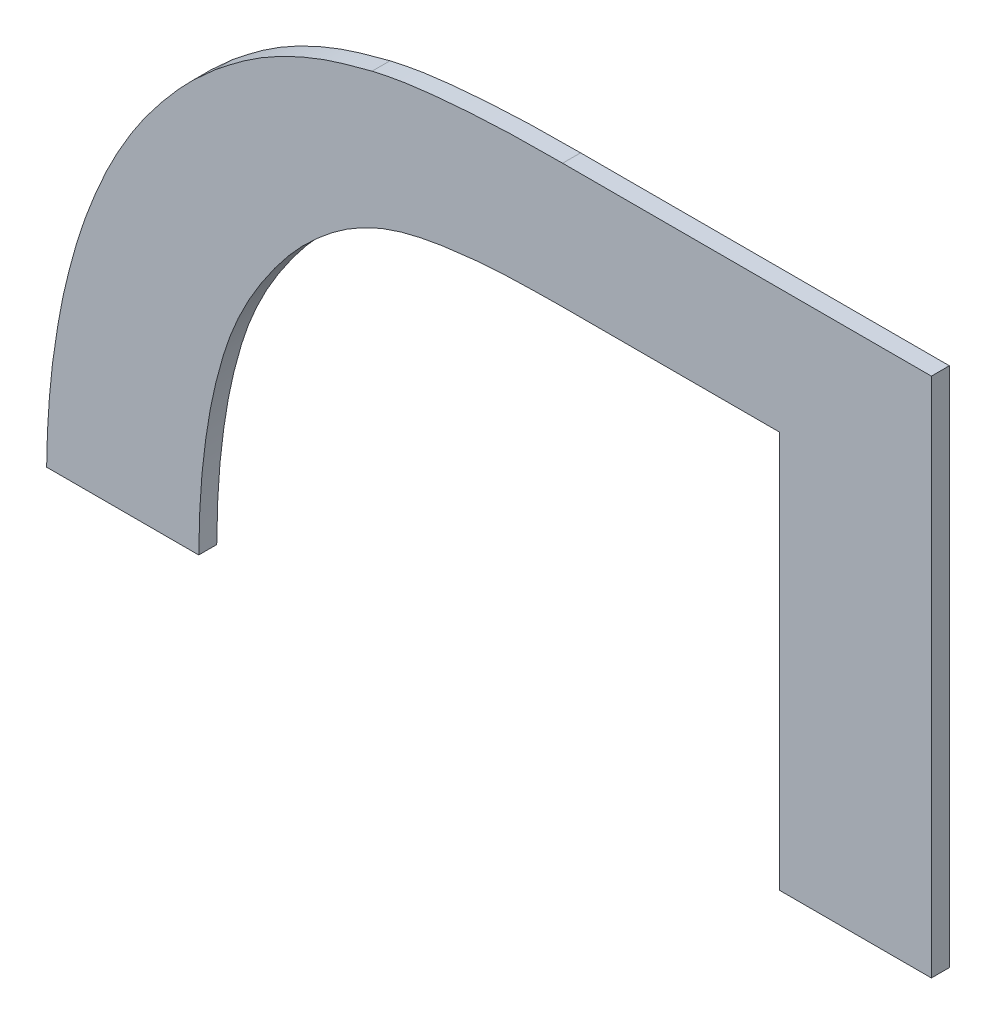
ISO-10303-21;
HEADER;
FILE_DESCRIPTION(('STEP AP214'),'2;1');
FILE_NAME('part.step','',(''),(''),'','','');
FILE_SCHEMA(('AUTOMOTIVE_DESIGN { 1 0 10303 214 1 1 1 1 }'));
ENDSEC;
DATA;
#1=APPLICATION_CONTEXT('core data for automotive mechanical design processes');
#2=APPLICATION_PROTOCOL_DEFINITION('international standard','automotive_design',2000,#1);
#3=PRODUCT_CONTEXT('',#1,'mechanical');
#4=PRODUCT('Part','Part','',(#3));
#5=PRODUCT_RELATED_PRODUCT_CATEGORY('part','',(#4));
#6=PRODUCT_DEFINITION_FORMATION('','',#4);
#7=PRODUCT_DEFINITION_CONTEXT('part definition',#1,'design');
#8=PRODUCT_DEFINITION('design','',#6,#7);
#9=PRODUCT_DEFINITION_SHAPE('','',#8);
#10=(LENGTH_UNIT() NAMED_UNIT(*) SI_UNIT(.MILLI.,.METRE.));
#11=(NAMED_UNIT(*) PLANE_ANGLE_UNIT() SI_UNIT($,.RADIAN.));
#12=(NAMED_UNIT(*) SI_UNIT($,.STERADIAN.) SOLID_ANGLE_UNIT());
#13=UNCERTAINTY_MEASURE_WITH_UNIT(LENGTH_MEASURE(1.E-05),#10,'distance_accuracy_value','');
#14=(GEOMETRIC_REPRESENTATION_CONTEXT(3) GLOBAL_UNCERTAINTY_ASSIGNED_CONTEXT((#13)) GLOBAL_UNIT_ASSIGNED_CONTEXT((#10,
#11,#12)) REPRESENTATION_CONTEXT('',''));
#15=CARTESIAN_POINT('',(0.,0.,0.));
#16=DIRECTION('',(0.,0.,1.));
#17=DIRECTION('',(1.,0.,0.));
#18=AXIS2_PLACEMENT_3D('',#15,#16,#17);
#19=CARTESIAN_POINT('',(11.5384615384616,-15.,0.5));
#20=DIRECTION('',(-1.,0.,0.));
#21=DIRECTION('',(0.,0.,1.));
#22=AXIS2_PLACEMENT_3D('',#19,#20,#21);
#23=PLANE('',#22);
#24=DIRECTION('',(0.,1.,0.));
#25=VECTOR('',#24,1.);
#26=CARTESIAN_POINT('',(11.5384615384616,-15.,0.5));
#27=LINE('',#26,#25);
#28=CARTESIAN_POINT('',(11.5384615384616,0.5,0.5));
#29=VERTEX_POINT('',#28);
#30=CARTESIAN_POINT('',(11.5384615384616,15.,0.5));
#31=VERTEX_POINT('',#30);
#32=EDGE_CURVE('E192',#29,#31,#27,.T.);
#33=ORIENTED_EDGE('',*,*,#32,.F.);
#34=DIRECTION('',(0.,0.,-1.));
#35=VECTOR('',#34,1.);
#36=CARTESIAN_POINT('',(11.5384615384616,0.5,0.5));
#37=LINE('',#36,#35);
#38=CARTESIAN_POINT('',(11.5384615384616,0.5,0.));
#39=VERTEX_POINT('',#38);
#40=EDGE_CURVE('E54',#29,#39,#37,.T.);
#41=ORIENTED_EDGE('',*,*,#40,.T.);
#42=DIRECTION('',(0.,1.,0.));
#43=VECTOR('',#42,1.);
#44=CARTESIAN_POINT('',(11.5384615384616,-15.,0.));
#45=LINE('',#44,#43);
#46=CARTESIAN_POINT('',(11.5384615384616,15.,0.));
#47=VERTEX_POINT('',#46);
#48=EDGE_CURVE('E204',#39,#47,#45,.T.);
#49=ORIENTED_EDGE('',*,*,#48,.T.);
#50=DIRECTION('',(0.,0.,-1.));
#51=VECTOR('',#50,1.);
#52=CARTESIAN_POINT('',(11.5384615384616,15.,0.5));
#53=LINE('',#52,#51);
#54=EDGE_CURVE('E191',#31,#47,#53,.T.);
#55=ORIENTED_EDGE('',*,*,#54,.F.);
#56=EDGE_LOOP('',(#33,#41,#49,#55));
#57=FACE_BOUND('',#56,.T.);
#58=ADVANCED_FACE('F39',(#57),#23,.F.);
#59=CARTESIAN_POINT('',(-1.382682115,14.9217036371468,0.5));
#60=DIRECTION('',(0.,0.,-1.));
#61=DIRECTION('',(-1.,0.,0.));
#62=AXIS2_PLACEMENT_3D('',#59,#60,#61);
#63=PLANE('',#62);
#64=CARTESIAN_POINT('',(-8.38341346153845,12.421875,0.5));
#65=CARTESIAN_POINT('',(-8.5763742109185,12.2524241476414,0.5));
#66=CARTESIAN_POINT('',(-8.96316917127404,11.9127554018949,0.5));
#67=CARTESIAN_POINT('',(-9.49442974637986,11.3531263259938,0.5));
#68=CARTESIAN_POINT('',(-9.98727140197635,10.7594508263141,0.5));
#69=CARTESIAN_POINT('',(-10.4564145661786,10.1419495197791,0.5));
#70=CARTESIAN_POINT('',(-10.8718532675337,9.47810992962567,0.5));
#71=CARTESIAN_POINT('',(-11.2612687557637,8.78703913595091,0.5));
#72=CARTESIAN_POINT('',(-11.6009333603342,8.05485950898088,0.5));
#73=CARTESIAN_POINT('',(-11.9135895116652,7.29353697132062,0.5));
#74=CARTESIAN_POINT('',(-12.1921448110855,6.50010412293509,0.5));
#75=CARTESIAN_POINT('',(-12.4210240181232,5.67507335119183,0.5));
#76=CARTESIAN_POINT('',(-12.6312911639853,4.82705995563567,0.5));
#77=CARTESIAN_POINT('',(-12.7876810881269,3.94679418723253,0.5));
#78=CARTESIAN_POINT('',(-12.9242014022081,3.04174255553388,0.5));
#79=CARTESIAN_POINT('',(-13.0108681859765,2.10672489963748,0.5));
#80=CARTESIAN_POINT('',(-13.0671005095875,1.14453241181177,0.5));
#81=CARTESIAN_POINT('',(-13.0736170055521,0.492872158907407,0.5));
#82=CARTESIAN_POINT('',(-13.0769230769231,0.162259615384614,0.5));
#83=B_SPLINE_CURVE_WITH_KNOTS('',3,(#64,#65,#66,#67,#68,#69,#70,#71,#72,#73,#74,#75,#76,#77,#78,
#79,#80,#81,#82),.UNSPECIFIED.,.F.,.F.,(4,1,1,1,1,1,1,1,1,1,1,1,1,1,1,1,4),(0.,
0.0568123354227024,0.113881839172627,0.170533068412123,0.227547439190597,0.285352691696646,
0.343701141573051,0.403000229313918,0.463842105103536,0.525815476342276,0.588967004682394,
0.653270524442472,0.719096589325222,0.786748639620031,0.855788310662137,0.92683581175127,1.),.UNSPECIFIED.);
#84=CARTESIAN_POINT('',(-8.38341346153845,12.421875,0.5));
#85=VERTEX_POINT('',#84);
#86=CARTESIAN_POINT('',(-13.0732253562633,0.5,0.5));
#87=VERTEX_POINT('',#86);
#88=EDGE_CURVE('E207',#85,#87,#83,.T.);
#89=ORIENTED_EDGE('',*,*,#88,.T.);
#90=DIRECTION('',(1.,0.,0.));
#91=VECTOR('',#90,1.);
#92=CARTESIAN_POINT('',(-1.382682115,0.5,0.5));
#93=LINE('',#92,#91);
#94=CARTESIAN_POINT('',(-8.84239701724573,0.5,0.5));
#95=VERTEX_POINT('',#94);
#96=EDGE_CURVE('E154',#87,#95,#93,.T.);
#97=ORIENTED_EDGE('',*,*,#96,.T.);
#98=CARTESIAN_POINT('',(-8.84615384615383,0.228365384615384,0.5));
#99=CARTESIAN_POINT('',(-8.84102265070386,0.611040812282681,0.5));
#100=CARTESIAN_POINT('',(-8.83104781455846,1.35494634561712,0.5));
#101=CARTESIAN_POINT('',(-8.7688632524729,2.43869195236612,0.5));
#102=CARTESIAN_POINT('',(-8.64610178114751,3.45296942584759,0.5));
#103=CARTESIAN_POINT('',(-8.48910134496591,4.39953306617696,0.5));
#104=CARTESIAN_POINT('',(-8.27474187359549,5.27537405447266,0.5));
#105=CARTESIAN_POINT('',(-8.02961811139682,6.0888839197475,0.5));
#106=CARTESIAN_POINT('',(-7.72124401259251,6.82942808224367,0.5));
#107=CARTESIAN_POINT('',(-7.36935137220557,7.50272356268187,0.5));
#108=CARTESIAN_POINT('',(-6.98332105801368,8.11324175983455,0.5));
#109=CARTESIAN_POINT('',(-6.58106360601976,8.6740961885661,0.5));
#110=CARTESIAN_POINT('',(-6.16052047137857,9.18344801718626,0.5));
#111=CARTESIAN_POINT('',(-5.71278067027083,9.63405007431265,0.5));
#112=CARTESIAN_POINT('',(-5.25130378739005,10.0392276651512,0.5));
#113=CARTESIAN_POINT('',(-4.76748665165962,10.3906854413108,0.5));
#114=CARTESIAN_POINT('',(-4.26268315422816,10.6883154133846,0.5));
#115=CARTESIAN_POINT('',(-3.90796096504983,10.8428174224566,0.5));
#116=CARTESIAN_POINT('',(-3.73197115384614,10.9194711538462,0.5));
#117=B_SPLINE_CURVE_WITH_KNOTS('',3,(#98,#99,#100,#101,#102,#103,#104,#105,#106,#107,#108,#109,
#110,#111,#112,#113,#114,#115,#116),.UNSPECIFIED.,.F.,.F.,(4,1,1,1,1,1,1,1,1,1,1,1,1,1,1,1,4),
(0.,0.0912579285711475,0.177401717268708,0.258693902805723,0.334791460647046,0.406045096597495,
0.473581442146877,0.537187194017057,0.597012411269007,0.654533357810073,0.709286197928439,
0.76151799593466,0.811847549047066,0.860604237354614,0.907805749105046,0.954259278657893,1.),.UNSPECIFIED.);
#118=CARTESIAN_POINT('',(-3.73197115384614,10.9194711538462,0.5));
#119=VERTEX_POINT('',#118);
#120=EDGE_CURVE('E146',#95,#119,#117,.T.);
#121=ORIENTED_EDGE('',*,*,#120,.T.);
#122=CARTESIAN_POINT('',(-3.73197115384614,10.9194711538462,0.5));
#123=CARTESIAN_POINT('',(-3.59445970567046,10.969794396746,0.5));
#124=CARTESIAN_POINT('',(-3.30308196474431,11.0764260483414,0.5));
#125=CARTESIAN_POINT('',(-2.82752523642942,11.1971170413422,0.5));
#126=CARTESIAN_POINT('',(-2.29679911688819,11.3081861854801,0.5));
#127=CARTESIAN_POINT('',(-1.70567242577352,11.3861422428105,0.5));
#128=CARTESIAN_POINT('',(-1.05713477037848,11.4619070265259,0.5));
#129=CARTESIAN_POINT('',(-0.347154860933927,11.5079477117086,0.5));
#130=CARTESIAN_POINT('',(0.420543764518022,11.5288121402493,0.5));
#131=CARTESIAN_POINT('',(0.95151171086871,11.5351734614394,0.5));
#132=CARTESIAN_POINT('',(1.22596153846156,11.5384615384615,0.5));
#133=B_SPLINE_CURVE_WITH_KNOTS('',3,(#122,#123,#124,#125,#126,#127,#128,#129,#130,#131,#132),
.UNSPECIFIED.,.F.,.F.,(4,1,1,1,1,1,1,1,4),(0.,0.0874250109285977,0.185247864979759,
0.292738353989421,0.411206101677025,0.541245594232324,0.682780938524953,0.836033950204801,1.),.UNSPECIFIED.);
#134=CARTESIAN_POINT('',(1.22596153846156,11.5384615384615,0.5));
#135=VERTEX_POINT('',#134);
#136=EDGE_CURVE('E130',#119,#135,#133,.T.);
#137=ORIENTED_EDGE('',*,*,#136,.T.);
#138=DIRECTION('',(1.,0.,0.));
#139=VECTOR('',#138,1.);
#140=CARTESIAN_POINT('',(1.22596153846156,11.5384615384615,0.5));
#141=LINE('',#140,#139);
#142=CARTESIAN_POINT('',(7.30769230769232,11.5384615384615,0.5));
#143=VERTEX_POINT('',#142);
#144=EDGE_CURVE('E136',#135,#143,#141,.T.);
#145=ORIENTED_EDGE('',*,*,#144,.T.);
#146=DIRECTION('',(0.,-1.,0.));
#147=VECTOR('',#146,1.);
#148=CARTESIAN_POINT('',(7.30769230769232,11.5384615384615,0.5));
#149=LINE('',#148,#147);
#150=CARTESIAN_POINT('',(7.30769230769232,0.5,0.5));
#151=VERTEX_POINT('',#150);
#152=EDGE_CURVE('E145',#143,#151,#149,.T.);
#153=ORIENTED_EDGE('',*,*,#152,.T.);
#154=EDGE_CURVE('E80',#151,#29,#93,.T.);
#155=ORIENTED_EDGE('',*,*,#154,.T.);
#156=ORIENTED_EDGE('',*,*,#32,.T.);
#157=DIRECTION('',(-1.,0.,0.));
#158=VECTOR('',#157,1.);
#159=CARTESIAN_POINT('',(11.5384615384616,15.,0.5));
#160=LINE('',#159,#158);
#161=CARTESIAN_POINT('',(1.28004807692309,15.,0.5));
#162=VERTEX_POINT('',#161);
#163=EDGE_CURVE('E197',#31,#162,#160,.T.);
#164=ORIENTED_EDGE('',*,*,#163,.T.);
#165=CARTESIAN_POINT('',(1.28004807692309,15.,0.5));
#166=CARTESIAN_POINT('',(0.999596733269862,14.9987330296525,0.5));
#167=CARTESIAN_POINT('',(0.454658301155939,14.996271209268,0.5));
#168=CARTESIAN_POINT('',(-0.33692015294195,14.9805809678215,0.5));
#169=CARTESIAN_POINT('',(-1.07812705706637,14.9427362679626,0.5));
#170=CARTESIAN_POINT('',(-1.76554701819305,14.8966364176264,0.5));
#171=CARTESIAN_POINT('',(-2.40264701489753,14.8352584266667,0.5));
#172=CARTESIAN_POINT('',(-2.98861310888563,14.7666225511488,0.5));
#173=CARTESIAN_POINT('',(-3.52390251528144,14.6770960246085,0.5));
#174=CARTESIAN_POINT('',(-3.86044482557913,14.6026827850799,0.5));
#175=CARTESIAN_POINT('',(-4.02043269230767,14.5673076923077,0.5));
#176=B_SPLINE_CURVE_WITH_KNOTS('',3,(#165,#166,#167,#168,#169,#170,#171,#172,#173,#174,#175),
.UNSPECIFIED.,.F.,.F.,(4,1,1,1,1,1,1,1,4),(0.,0.157890974512345,0.306794251633478,
0.445674152625697,0.575680435633188,0.694631463926725,0.805977805205995,0.907764355050554,1.),.UNSPECIFIED.);
#177=CARTESIAN_POINT('',(-4.02043269230767,14.5673076923077,0.5));
#178=VERTEX_POINT('',#177);
#179=EDGE_CURVE('E200',#162,#178,#176,.T.);
#180=ORIENTED_EDGE('',*,*,#179,.T.);
#181=CARTESIAN_POINT('',(-4.02043269230767,14.5673076923077,0.5));
#182=CARTESIAN_POINT('',(-4.43418888236122,14.458753919871,0.5));
#183=CARTESIAN_POINT('',(-5.24705334367218,14.2454894276984,0.5));
#184=CARTESIAN_POINT('',(-6.39449703356027,13.7657785192818,0.5));
#185=CARTESIAN_POINT('',(-7.44790027478785,13.16406871538,0.5));
#186=CARTESIAN_POINT('',(-8.07263471229969,12.6684327586991,0.5));
#187=CARTESIAN_POINT('',(-8.38341346153845,12.421875,0.5));
#188=B_SPLINE_CURVE_WITH_KNOTS('',3,(#181,#182,#183,#184,#185,#186,#187),.UNSPECIFIED.,.F.,.F.,
(4,1,1,1,4),(0.,0.26119485261401,0.513142807941568,0.757809302447896,1.),.UNSPECIFIED.);
#189=EDGE_CURVE('E208',#178,#85,#188,.T.);
#190=ORIENTED_EDGE('',*,*,#189,.T.);
#191=EDGE_LOOP('',(#89,#97,#121,#137,#145,#153,#155,#156,#164,#180,#190));
#192=FACE_BOUND('',#191,.T.);
#193=ADVANCED_FACE('F147',(#192),#63,.F.);
#194=CARTESIAN_POINT('',(7.30769230769232,11.5384615384615,0.5));
#195=DIRECTION('',(1.,0.,0.));
#196=DIRECTION('',(0.,0.,-1.));
#197=AXIS2_PLACEMENT_3D('',#194,#195,#196);
#198=PLANE('',#197);
#199=DIRECTION('',(0.,-1.,0.));
#200=VECTOR('',#199,1.);
#201=CARTESIAN_POINT('',(7.30769230769232,11.5384615384615,0.));
#202=LINE('',#201,#200);
#203=CARTESIAN_POINT('',(7.30769230769232,11.5384615384615,0.));
#204=VERTEX_POINT('',#203);
#205=CARTESIAN_POINT('',(7.30769230769232,0.5,0.));
#206=VERTEX_POINT('',#205);
#207=EDGE_CURVE('E209',#204,#206,#202,.T.);
#208=ORIENTED_EDGE('',*,*,#207,.T.);
#209=DIRECTION('',(0.,0.,1.));
#210=VECTOR('',#209,1.);
#211=CARTESIAN_POINT('',(7.30769230769232,0.5,0.5));
#212=LINE('',#211,#210);
#213=EDGE_CURVE('E206',#206,#151,#212,.T.);
#214=ORIENTED_EDGE('',*,*,#213,.T.);
#215=ORIENTED_EDGE('',*,*,#152,.F.);
#216=DIRECTION('',(0.,0.,-1.));
#217=VECTOR('',#216,1.);
#218=CARTESIAN_POINT('',(7.30769230769232,11.5384615384615,0.5));
#219=LINE('',#218,#217);
#220=EDGE_CURVE('E138',#143,#204,#219,.T.);
#221=ORIENTED_EDGE('',*,*,#220,.T.);
#222=EDGE_LOOP('',(#208,#214,#215,#221));
#223=FACE_BOUND('',#222,.T.);
#224=ADVANCED_FACE('F180',(#223),#198,.F.);
#225=CARTESIAN_POINT('',(11.5384615384616,15.,0.5));
#226=DIRECTION('',(0.,-1.,0.));
#227=DIRECTION('',(0.,0.,-1.));
#228=AXIS2_PLACEMENT_3D('',#225,#226,#227);
#229=PLANE('',#228);
#230=DIRECTION('',(-1.,0.,0.));
#231=VECTOR('',#230,1.);
#232=CARTESIAN_POINT('',(11.5384615384616,15.,0.));
#233=LINE('',#232,#231);
#234=CARTESIAN_POINT('',(1.28004807692309,15.,0.));
#235=VERTEX_POINT('',#234);
#236=EDGE_CURVE('E276',#47,#235,#233,.T.);
#237=ORIENTED_EDGE('',*,*,#236,.T.);
#238=DIRECTION('',(0.,0.,-1.));
#239=VECTOR('',#238,1.);
#240=CARTESIAN_POINT('',(1.28004807692309,15.,0.5));
#241=LINE('',#240,#239);
#242=EDGE_CURVE('E267',#162,#235,#241,.T.);
#243=ORIENTED_EDGE('',*,*,#242,.F.);
#244=ORIENTED_EDGE('',*,*,#163,.F.);
#245=ORIENTED_EDGE('',*,*,#54,.T.);
#246=EDGE_LOOP('',(#237,#243,#244,#245));
#247=FACE_BOUND('',#246,.T.);
#248=ADVANCED_FACE('F179',(#247),#229,.F.);
#249=DIRECTION('',(0.,0.,-1.));
#250=VECTOR('',#249,1.);
#251=SURFACE_OF_LINEAR_EXTRUSION('',#176,#250);
#252=CARTESIAN_POINT('',(1.28004807692309,15.,0.));
#253=CARTESIAN_POINT('',(0.999596733269862,14.9987330296525,0.));
#254=CARTESIAN_POINT('',(0.454658301155939,14.996271209268,0.));
#255=CARTESIAN_POINT('',(-0.33692015294195,14.9805809678215,0.));
#256=CARTESIAN_POINT('',(-1.07812705706637,14.9427362679626,0.));
#257=CARTESIAN_POINT('',(-1.76554701819305,14.8966364176264,0.));
#258=CARTESIAN_POINT('',(-2.40264701489753,14.8352584266667,0.));
#259=CARTESIAN_POINT('',(-2.98861310888563,14.7666225511488,0.));
#260=CARTESIAN_POINT('',(-3.52390251528144,14.6770960246085,0.));
#261=CARTESIAN_POINT('',(-3.86044482557913,14.6026827850799,0.));
#262=CARTESIAN_POINT('',(-4.02043269230767,14.5673076923077,0.));
#263=B_SPLINE_CURVE_WITH_KNOTS('',3,(#252,#253,#254,#255,#256,#257,#258,#259,#260,#261,#262),
.UNSPECIFIED.,.F.,.F.,(4,1,1,1,1,1,1,1,4),(0.,0.157890974512345,0.306794251633478,
0.445674152625697,0.575680435633188,0.694631463926725,0.805977805205995,0.907764355050554,1.),.UNSPECIFIED.);
#264=CARTESIAN_POINT('',(-4.02043269230767,14.5673076923077,0.));
#265=VERTEX_POINT('',#264);
#266=EDGE_CURVE('E269',#235,#265,#263,.T.);
#267=ORIENTED_EDGE('',*,*,#266,.T.);
#268=DIRECTION('',(0.,0.,-1.));
#269=VECTOR('',#268,1.);
#270=CARTESIAN_POINT('',(-4.02043269230767,14.5673076923077,0.5));
#271=LINE('',#270,#269);
#272=EDGE_CURVE('E251',#178,#265,#271,.T.);
#273=ORIENTED_EDGE('',*,*,#272,.F.);
#274=ORIENTED_EDGE('',*,*,#179,.F.);
#275=ORIENTED_EDGE('',*,*,#242,.T.);
#276=EDGE_LOOP('',(#267,#273,#274,#275));
#277=FACE_BOUND('',#276,.T.);
#278=ADVANCED_FACE('F237',(#277),#251,.F.);
#279=DIRECTION('',(0.,0.,-1.));
#280=VECTOR('',#279,1.);
#281=SURFACE_OF_LINEAR_EXTRUSION('',#188,#280);
#282=CARTESIAN_POINT('',(-4.02043269230767,14.5673076923077,0.));
#283=CARTESIAN_POINT('',(-4.43418888236122,14.458753919871,0.));
#284=CARTESIAN_POINT('',(-5.24705334367218,14.2454894276984,0.));
#285=CARTESIAN_POINT('',(-6.39449703356027,13.7657785192818,0.));
#286=CARTESIAN_POINT('',(-7.44790027478785,13.16406871538,0.));
#287=CARTESIAN_POINT('',(-8.07263471229969,12.6684327586991,0.));
#288=CARTESIAN_POINT('',(-8.38341346153845,12.421875,0.));
#289=B_SPLINE_CURVE_WITH_KNOTS('',3,(#282,#283,#284,#285,#286,#287,#288),.UNSPECIFIED.,.F.,.F.,
(4,1,1,1,4),(0.,0.26119485261401,0.513142807941568,0.757809302447896,1.),.UNSPECIFIED.);
#290=CARTESIAN_POINT('',(-8.38341346153845,12.421875,0.));
#291=VERTEX_POINT('',#290);
#292=EDGE_CURVE('E257',#265,#291,#289,.T.);
#293=ORIENTED_EDGE('',*,*,#292,.T.);
#294=DIRECTION('',(0.,0.,-1.));
#295=VECTOR('',#294,1.);
#296=CARTESIAN_POINT('',(-8.38341346153845,12.421875,0.5));
#297=LINE('',#296,#295);
#298=EDGE_CURVE('E254',#85,#291,#297,.T.);
#299=ORIENTED_EDGE('',*,*,#298,.F.);
#300=ORIENTED_EDGE('',*,*,#189,.F.);
#301=ORIENTED_EDGE('',*,*,#272,.T.);
#302=EDGE_LOOP('',(#293,#299,#300,#301));
#303=FACE_BOUND('',#302,.T.);
#304=ADVANCED_FACE('F235',(#303),#281,.F.);
#305=DIRECTION('',(0.,0.,-1.));
#306=VECTOR('',#305,1.);
#307=SURFACE_OF_LINEAR_EXTRUSION('',#83,#306);
#308=CARTESIAN_POINT('',(-8.38341346153845,12.421875,0.));
#309=CARTESIAN_POINT('',(-8.5763742109185,12.2524241476414,0.));
#310=CARTESIAN_POINT('',(-8.96316917127404,11.9127554018949,0.));
#311=CARTESIAN_POINT('',(-9.49442974637986,11.3531263259938,0.));
#312=CARTESIAN_POINT('',(-9.98727140197635,10.7594508263141,0.));
#313=CARTESIAN_POINT('',(-10.4564145661786,10.1419495197791,0.));
#314=CARTESIAN_POINT('',(-10.8718532675337,9.47810992962567,0.));
#315=CARTESIAN_POINT('',(-11.2612687557637,8.78703913595091,0.));
#316=CARTESIAN_POINT('',(-11.6009333603342,8.05485950898088,0.));
#317=CARTESIAN_POINT('',(-11.9135895116652,7.29353697132062,0.));
#318=CARTESIAN_POINT('',(-12.1921448110855,6.50010412293509,0.));
#319=CARTESIAN_POINT('',(-12.4210240181232,5.67507335119183,0.));
#320=CARTESIAN_POINT('',(-12.6312911639853,4.82705995563567,0.));
#321=CARTESIAN_POINT('',(-12.7876810881269,3.94679418723253,0.));
#322=CARTESIAN_POINT('',(-12.9242014022081,3.04174255553388,0.));
#323=CARTESIAN_POINT('',(-13.0108681859765,2.10672489963748,0.));
#324=CARTESIAN_POINT('',(-13.0671005095875,1.14453241181177,0.));
#325=CARTESIAN_POINT('',(-13.0736170055521,0.492872158907407,0.));
#326=CARTESIAN_POINT('',(-13.0769230769231,0.162259615384614,0.));
#327=B_SPLINE_CURVE_WITH_KNOTS('',3,(#308,#309,#310,#311,#312,#313,#314,#315,#316,#317,#318,
#319,#320,#321,#322,#323,#324,#325,#326),.UNSPECIFIED.,.F.,.F.,(4,1,1,1,1,1,1,1,1,1,1,1,1,1,1,1,
4),(0.,0.0568123354227024,0.113881839172627,0.170533068412123,0.227547439190597,
0.285352691696646,0.343701141573051,0.403000229313918,0.463842105103536,0.525815476342276,
0.588967004682394,0.653270524442472,0.719096589325222,0.786748639620031,0.855788310662137,
0.92683581175127,1.),.UNSPECIFIED.);
#328=CARTESIAN_POINT('',(-13.0732253086048,0.500003710047275,0.));
#329=VERTEX_POINT('',#328);
#330=EDGE_CURVE('E248',#291,#329,#327,.T.);
#331=ORIENTED_EDGE('',*,*,#330,.T.);
#332=DIRECTION('',(0.,0.,-1.));
#333=VECTOR('',#332,1.);
#334=CARTESIAN_POINT('',(-13.0732253562633,0.5,0.5));
#335=LINE('',#334,#333);
#336=EDGE_CURVE('E78',#329,#87,#335,.F.);
#337=ORIENTED_EDGE('',*,*,#336,.T.);
#338=ORIENTED_EDGE('',*,*,#88,.F.);
#339=ORIENTED_EDGE('',*,*,#298,.T.);
#340=EDGE_LOOP('',(#331,#337,#338,#339));
#341=FACE_BOUND('',#340,.T.);
#342=ADVANCED_FACE('F234',(#341),#307,.F.);
#343=CARTESIAN_POINT('',(-1.382682115,14.9217036371468,0.));
#344=DIRECTION('',(0.,0.,-1.));
#345=DIRECTION('',(-1.,0.,0.));
#346=AXIS2_PLACEMENT_3D('',#343,#344,#345);
#347=PLANE('',#346);
#348=DIRECTION('',(1.,0.,0.));
#349=VECTOR('',#348,1.);
#350=CARTESIAN_POINT('',(-1.382682115,0.5,0.));
#351=LINE('',#350,#349);
#352=CARTESIAN_POINT('',(-8.84239701724573,0.5,0.));
#353=VERTEX_POINT('',#352);
#354=EDGE_CURVE('E43',#329,#353,#351,.T.);
#355=ORIENTED_EDGE('',*,*,#354,.F.);
#356=ORIENTED_EDGE('',*,*,#330,.F.);
#357=ORIENTED_EDGE('',*,*,#292,.F.);
#358=ORIENTED_EDGE('',*,*,#266,.F.);
#359=ORIENTED_EDGE('',*,*,#236,.F.);
#360=ORIENTED_EDGE('',*,*,#48,.F.);
#361=DIRECTION('',(1.,0.,0.));
#362=VECTOR('',#361,1.);
#363=CARTESIAN_POINT('',(-1.382682115,0.5,0.));
#364=LINE('',#363,#362);
#365=EDGE_CURVE('E11',#206,#39,#364,.T.);
#366=ORIENTED_EDGE('',*,*,#365,.F.);
#367=ORIENTED_EDGE('',*,*,#207,.F.);
#368=DIRECTION('',(1.,0.,0.));
#369=VECTOR('',#368,1.);
#370=CARTESIAN_POINT('',(1.22596153846156,11.5384615384615,0.));
#371=LINE('',#370,#369);
#372=CARTESIAN_POINT('',(1.22596153846156,11.5384615384615,0.));
#373=VERTEX_POINT('',#372);
#374=EDGE_CURVE('E133',#373,#204,#371,.T.);
#375=ORIENTED_EDGE('',*,*,#374,.F.);
#376=CARTESIAN_POINT('',(-3.73197115384614,10.9194711538462,0.));
#377=CARTESIAN_POINT('',(-3.59445970567046,10.969794396746,0.));
#378=CARTESIAN_POINT('',(-3.30308196474431,11.0764260483414,0.));
#379=CARTESIAN_POINT('',(-2.82752523642942,11.1971170413422,0.));
#380=CARTESIAN_POINT('',(-2.29679911688819,11.3081861854801,0.));
#381=CARTESIAN_POINT('',(-1.70567242577352,11.3861422428105,0.));
#382=CARTESIAN_POINT('',(-1.05713477037848,11.4619070265259,0.));
#383=CARTESIAN_POINT('',(-0.347154860933927,11.5079477117086,0.));
#384=CARTESIAN_POINT('',(0.420543764518022,11.5288121402493,0.));
#385=CARTESIAN_POINT('',(0.95151171086871,11.5351734614394,0.));
#386=CARTESIAN_POINT('',(1.22596153846156,11.5384615384615,0.));
#387=B_SPLINE_CURVE_WITH_KNOTS('',3,(#376,#377,#378,#379,#380,#381,#382,#383,#384,#385,#386),
.UNSPECIFIED.,.F.,.F.,(4,1,1,1,1,1,1,1,4),(0.,0.0874250109285977,0.185247864979759,
0.292738353989421,0.411206101677025,0.541245594232324,0.682780938524953,0.836033950204801,1.),.UNSPECIFIED.);
#388=CARTESIAN_POINT('',(-3.73197115384614,10.9194711538462,0.));
#389=VERTEX_POINT('',#388);
#390=EDGE_CURVE('E129',#389,#373,#387,.T.);
#391=ORIENTED_EDGE('',*,*,#390,.F.);
#392=CARTESIAN_POINT('',(-8.84615384615383,0.228365384615384,0.));
#393=CARTESIAN_POINT('',(-8.84102265070386,0.611040812282681,0.));
#394=CARTESIAN_POINT('',(-8.83104781455846,1.35494634561712,0.));
#395=CARTESIAN_POINT('',(-8.7688632524729,2.43869195236612,0.));
#396=CARTESIAN_POINT('',(-8.64610178114751,3.45296942584759,0.));
#397=CARTESIAN_POINT('',(-8.48910134496591,4.39953306617696,0.));
#398=CARTESIAN_POINT('',(-8.27474187359549,5.27537405447266,0.));
#399=CARTESIAN_POINT('',(-8.02961811139682,6.0888839197475,0.));
#400=CARTESIAN_POINT('',(-7.72124401259251,6.82942808224367,0.));
#401=CARTESIAN_POINT('',(-7.36935137220557,7.50272356268187,0.));
#402=CARTESIAN_POINT('',(-6.98332105801368,8.11324175983455,0.));
#403=CARTESIAN_POINT('',(-6.58106360601976,8.6740961885661,0.));
#404=CARTESIAN_POINT('',(-6.16052047137857,9.18344801718626,0.));
#405=CARTESIAN_POINT('',(-5.71278067027083,9.63405007431265,0.));
#406=CARTESIAN_POINT('',(-5.25130378739005,10.0392276651512,0.));
#407=CARTESIAN_POINT('',(-4.76748665165962,10.3906854413108,0.));
#408=CARTESIAN_POINT('',(-4.26268315422816,10.6883154133846,0.));
#409=CARTESIAN_POINT('',(-3.90796096504983,10.8428174224566,0.));
#410=CARTESIAN_POINT('',(-3.73197115384614,10.9194711538462,0.));
#411=B_SPLINE_CURVE_WITH_KNOTS('',3,(#392,#393,#394,#395,#396,#397,#398,#399,#400,#401,#402,
#403,#404,#405,#406,#407,#408,#409,#410),.UNSPECIFIED.,.F.,.F.,(4,1,1,1,1,1,1,1,1,1,1,1,1,1,1,1,
4),(0.,0.0912579285711475,0.177401717268708,0.258693902805723,0.334791460647046,
0.406045096597495,0.473581442146877,0.537187194017057,0.597012411269007,0.654533357810073,
0.709286197928439,0.76151799593466,0.811847549047066,0.860604237354614,0.907805749105046,
0.954259278657893,1.),.UNSPECIFIED.);
#412=EDGE_CURVE('E297',#353,#389,#411,.T.);
#413=ORIENTED_EDGE('',*,*,#412,.F.);
#414=EDGE_LOOP('',(#355,#356,#357,#358,#359,#360,#366,#367,#375,#391,#413));
#415=FACE_BOUND('',#414,.T.);
#416=ADVANCED_FACE('F41',(#415),#347,.T.);
#417=CARTESIAN_POINT('',(1.22596153846156,11.5384615384615,0.5));
#418=DIRECTION('',(0.,1.,0.));
#419=DIRECTION('',(0.,0.,1.));
#420=AXIS2_PLACEMENT_3D('',#417,#418,#419);
#421=PLANE('',#420);
#422=ORIENTED_EDGE('',*,*,#374,.T.);
#423=ORIENTED_EDGE('',*,*,#220,.F.);
#424=ORIENTED_EDGE('',*,*,#144,.F.);
#425=DIRECTION('',(0.,0.,-1.));
#426=VECTOR('',#425,1.);
#427=CARTESIAN_POINT('',(1.22596153846156,11.5384615384615,0.5));
#428=LINE('',#427,#426);
#429=EDGE_CURVE('E122',#135,#373,#428,.T.);
#430=ORIENTED_EDGE('',*,*,#429,.T.);
#431=EDGE_LOOP('',(#422,#423,#424,#430));
#432=FACE_BOUND('',#431,.T.);
#433=ADVANCED_FACE('F140',(#432),#421,.F.);
#434=DIRECTION('',(0.,0.,-1.));
#435=VECTOR('',#434,1.);
#436=SURFACE_OF_LINEAR_EXTRUSION('',#133,#435);
#437=ORIENTED_EDGE('',*,*,#390,.T.);
#438=ORIENTED_EDGE('',*,*,#429,.F.);
#439=ORIENTED_EDGE('',*,*,#136,.F.);
#440=DIRECTION('',(0.,0.,-1.));
#441=VECTOR('',#440,1.);
#442=CARTESIAN_POINT('',(-3.73197115384614,10.9194711538462,0.5));
#443=LINE('',#442,#441);
#444=EDGE_CURVE('E288',#119,#389,#443,.T.);
#445=ORIENTED_EDGE('',*,*,#444,.T.);
#446=EDGE_LOOP('',(#437,#438,#439,#445));
#447=FACE_BOUND('',#446,.T.);
#448=ADVANCED_FACE('F125',(#447),#436,.F.);
#449=DIRECTION('',(0.,0.,-1.));
#450=VECTOR('',#449,1.);
#451=SURFACE_OF_LINEAR_EXTRUSION('',#117,#450);
#452=ORIENTED_EDGE('',*,*,#120,.F.);
#453=DIRECTION('',(0.,0.,-1.));
#454=VECTOR('',#453,1.);
#455=CARTESIAN_POINT('',(-8.84239701724573,0.5,0.5));
#456=LINE('',#455,#454);
#457=EDGE_CURVE('E294',#95,#353,#456,.T.);
#458=ORIENTED_EDGE('',*,*,#457,.T.);
#459=ORIENTED_EDGE('',*,*,#412,.T.);
#460=ORIENTED_EDGE('',*,*,#444,.F.);
#461=EDGE_LOOP('',(#452,#458,#459,#460));
#462=FACE_BOUND('',#461,.T.);
#463=ADVANCED_FACE('F170',(#462),#451,.F.);
#464=CARTESIAN_POINT('',(-17.,0.5,1.));
#465=DIRECTION('',(0.,1.,0.));
#466=DIRECTION('',(0.,0.,1.));
#467=AXIS2_PLACEMENT_3D('',#464,#465,#466);
#468=PLANE('',#467);
#469=ORIENTED_EDGE('',*,*,#354,.T.);
#470=ORIENTED_EDGE('',*,*,#457,.F.);
#471=ORIENTED_EDGE('',*,*,#96,.F.);
#472=ORIENTED_EDGE('',*,*,#336,.F.);
#473=EDGE_LOOP('',(#469,#470,#471,#472));
#474=FACE_BOUND('',#473,.T.);
#475=ADVANCED_FACE('F176',(#474),#468,.F.);
#476=ORIENTED_EDGE('',*,*,#154,.F.);
#477=ORIENTED_EDGE('',*,*,#213,.F.);
#478=ORIENTED_EDGE('',*,*,#365,.T.);
#479=ORIENTED_EDGE('',*,*,#40,.F.);
#480=EDGE_LOOP('',(#476,#477,#478,#479));
#481=FACE_BOUND('',#480,.T.);
#482=ADVANCED_FACE('F171',(#481),#468,.F.);
#483=CLOSED_SHELL('',(#58,#193,#224,#248,#278,#304,#342,#416,#433,#448,#463,#475,#482));
#484=MANIFOLD_SOLID_BREP('B2',#483);
#485=ADVANCED_BREP_SHAPE_REPRESENTATION('',(#18,#484),#14);
#486=SHAPE_DEFINITION_REPRESENTATION(#9,#485);
ENDSEC;
END-ISO-10303-21;
